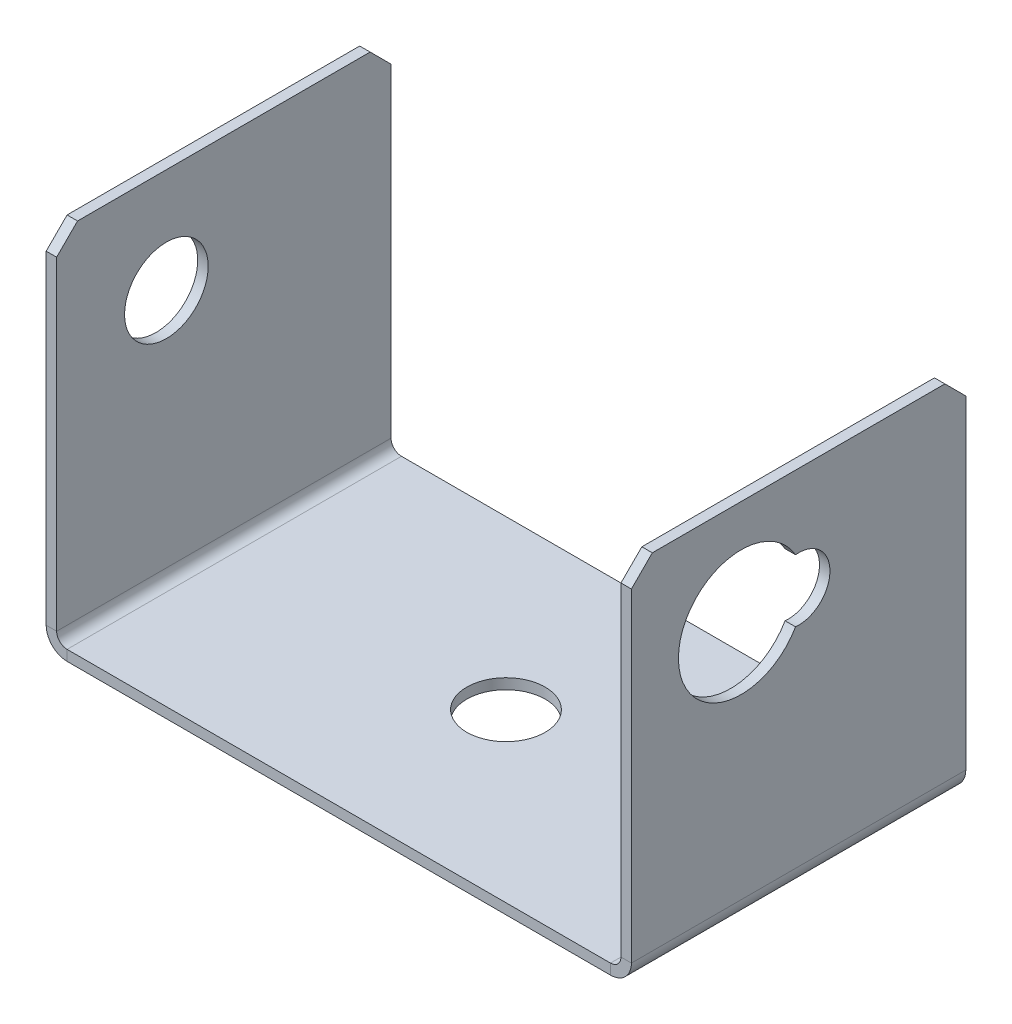
ISO-10303-21;
HEADER;
FILE_DESCRIPTION(('STEP AP214'),'2;1');
FILE_NAME('part.step','',(''),(''),'','','');
FILE_SCHEMA(('AUTOMOTIVE_DESIGN { 1 0 10303 214 1 1 1 1 }'));
ENDSEC;
DATA;
#1=APPLICATION_CONTEXT('core data for automotive mechanical design processes');
#2=APPLICATION_PROTOCOL_DEFINITION('international standard','automotive_design',2000,#1);
#3=PRODUCT_CONTEXT('',#1,'mechanical');
#4=PRODUCT('Part','Part','',(#3));
#5=PRODUCT_RELATED_PRODUCT_CATEGORY('part','',(#4));
#6=PRODUCT_DEFINITION_FORMATION('','',#4);
#7=PRODUCT_DEFINITION_CONTEXT('part definition',#1,'design');
#8=PRODUCT_DEFINITION('design','',#6,#7);
#9=PRODUCT_DEFINITION_SHAPE('','',#8);
#10=(LENGTH_UNIT() NAMED_UNIT(*) SI_UNIT(.MILLI.,.METRE.));
#11=(NAMED_UNIT(*) PLANE_ANGLE_UNIT() SI_UNIT($,.RADIAN.));
#12=(NAMED_UNIT(*) SI_UNIT($,.STERADIAN.) SOLID_ANGLE_UNIT());
#13=UNCERTAINTY_MEASURE_WITH_UNIT(LENGTH_MEASURE(1.E-05),#10,'distance_accuracy_value','');
#14=(GEOMETRIC_REPRESENTATION_CONTEXT(3) GLOBAL_UNCERTAINTY_ASSIGNED_CONTEXT((#13)) GLOBAL_UNIT_ASSIGNED_CONTEXT((#10,
#11,#12)) REPRESENTATION_CONTEXT('',''));
#15=CARTESIAN_POINT('',(0.,0.,0.));
#16=DIRECTION('',(0.,0.,1.));
#17=DIRECTION('',(1.,0.,0.));
#18=AXIS2_PLACEMENT_3D('',#15,#16,#17);
#19=CARTESIAN_POINT('',(0.,2.,32.));
#20=DIRECTION('',(0.,0.,1.));
#21=DIRECTION('',(1.,0.,0.));
#22=AXIS2_PLACEMENT_3D('',#19,#20,#21);
#23=PLANE('',#22);
#24=DIRECTION('',(1.,0.,0.));
#25=VECTOR('',#24,1.);
#26=CARTESIAN_POINT('',(0.,2.,32.));
#27=LINE('',#26,#25);
#28=CARTESIAN_POINT('',(0.,2.,32.));
#29=VERTEX_POINT('',#28);
#30=CARTESIAN_POINT('',(1.,2.,32.));
#31=VERTEX_POINT('',#30);
#32=EDGE_CURVE('E298',#29,#31,#27,.T.);
#33=ORIENTED_EDGE('',*,*,#32,.F.);
#34=CARTESIAN_POINT('',(2.,2.,32.));
#35=DIRECTION('',(0.,0.,-1.));
#36=DIRECTION('',(-1.,0.,0.));
#37=AXIS2_PLACEMENT_3D('',#34,#35,#36);
#38=CIRCLE('',#37,2.);
#39=CARTESIAN_POINT('',(2.,0.,32.));
#40=VERTEX_POINT('',#39);
#41=EDGE_CURVE('E214',#29,#40,#38,.F.);
#42=ORIENTED_EDGE('',*,*,#41,.T.);
#43=DIRECTION('',(0.,-1.,0.));
#44=VECTOR('',#43,1.);
#45=CARTESIAN_POINT('',(2.,1.,32.));
#46=LINE('',#45,#44);
#47=CARTESIAN_POINT('',(2.,1.,32.));
#48=VERTEX_POINT('',#47);
#49=EDGE_CURVE('E296',#48,#40,#46,.T.);
#50=ORIENTED_EDGE('',*,*,#49,.F.);
#51=CARTESIAN_POINT('',(2.,2.,32.));
#52=DIRECTION('',(0.,0.,1.));
#53=DIRECTION('',(1.,0.,0.));
#54=AXIS2_PLACEMENT_3D('',#51,#52,#53);
#55=CIRCLE('',#54,1.);
#56=EDGE_CURVE('E207',#31,#48,#55,.T.);
#57=ORIENTED_EDGE('',*,*,#56,.F.);
#58=EDGE_LOOP('',(#33,#42,#50,#57));
#59=FACE_BOUND('',#58,.T.);
#60=ADVANCED_FACE('F39',(#59),#23,.T.);
#61=CARTESIAN_POINT('',(2.,1.,32.));
#62=DIRECTION('',(0.,0.,1.));
#63=DIRECTION('',(1.,0.,0.));
#64=AXIS2_PLACEMENT_3D('',#61,#62,#63);
#65=PLANE('',#64);
#66=DIRECTION('',(0.,1.,0.));
#67=VECTOR('',#66,1.);
#68=CARTESIAN_POINT('',(1.,35.,32.));
#69=LINE('',#68,#67);
#70=CARTESIAN_POINT('',(1.,33.,32.));
#71=VERTEX_POINT('',#70);
#72=EDGE_CURVE('E210',#71,#31,#69,.F.);
#73=ORIENTED_EDGE('',*,*,#72,.F.);
#74=DIRECTION('',(-1.,0.,0.));
#75=VECTOR('',#74,1.);
#76=CARTESIAN_POINT('',(2.,33.,32.));
#77=LINE('',#76,#75);
#78=CARTESIAN_POINT('',(0.,33.,32.));
#79=VERTEX_POINT('',#78);
#80=EDGE_CURVE('E11',#71,#79,#77,.T.);
#81=ORIENTED_EDGE('',*,*,#80,.T.);
#82=DIRECTION('',(0.,-1.,0.));
#83=VECTOR('',#82,1.);
#84=CARTESIAN_POINT('',(0.,35.,32.));
#85=LINE('',#84,#83);
#86=EDGE_CURVE('E212',#79,#29,#85,.T.);
#87=ORIENTED_EDGE('',*,*,#86,.T.);
#88=ORIENTED_EDGE('',*,*,#32,.T.);
#89=EDGE_LOOP('',(#73,#81,#87,#88));
#90=FACE_BOUND('',#89,.T.);
#91=ADVANCED_FACE('F357',(#90),#65,.T.);
#92=CARTESIAN_POINT('',(2.,0.,0.));
#93=DIRECTION('',(0.,0.,-1.));
#94=DIRECTION('',(-1.,0.,0.));
#95=AXIS2_PLACEMENT_3D('',#92,#93,#94);
#96=PLANE('',#95);
#97=DIRECTION('',(0.,1.,0.));
#98=VECTOR('',#97,1.);
#99=CARTESIAN_POINT('',(2.,0.,0.));
#100=LINE('',#99,#98);
#101=CARTESIAN_POINT('',(2.,0.,0.));
#102=VERTEX_POINT('',#101);
#103=CARTESIAN_POINT('',(2.,1.,0.));
#104=VERTEX_POINT('',#103);
#105=EDGE_CURVE('E294',#102,#104,#100,.T.);
#106=ORIENTED_EDGE('',*,*,#105,.F.);
#107=CARTESIAN_POINT('',(2.,2.,0.));
#108=DIRECTION('',(0.,0.,-1.));
#109=DIRECTION('',(-1.,0.,0.));
#110=AXIS2_PLACEMENT_3D('',#107,#108,#109);
#111=CIRCLE('',#110,2.);
#112=CARTESIAN_POINT('',(0.,2.,0.));
#113=VERTEX_POINT('',#112);
#114=EDGE_CURVE('E242',#113,#102,#111,.F.);
#115=ORIENTED_EDGE('',*,*,#114,.F.);
#116=DIRECTION('',(-1.,0.,0.));
#117=VECTOR('',#116,1.);
#118=CARTESIAN_POINT('',(1.,2.,0.));
#119=LINE('',#118,#117);
#120=CARTESIAN_POINT('',(1.,2.,0.));
#121=VERTEX_POINT('',#120);
#122=EDGE_CURVE('E291',#121,#113,#119,.T.);
#123=ORIENTED_EDGE('',*,*,#122,.F.);
#124=CARTESIAN_POINT('',(2.,2.,0.));
#125=DIRECTION('',(0.,0.,1.));
#126=DIRECTION('',(1.,0.,0.));
#127=AXIS2_PLACEMENT_3D('',#124,#125,#126);
#128=CIRCLE('',#127,1.);
#129=EDGE_CURVE('E235',#121,#104,#128,.T.);
#130=ORIENTED_EDGE('',*,*,#129,.T.);
#131=EDGE_LOOP('',(#106,#115,#123,#130));
#132=FACE_BOUND('',#131,.T.);
#133=ADVANCED_FACE('F428',(#132),#96,.T.);
#134=CARTESIAN_POINT('',(1.,2.,0.));
#135=DIRECTION('',(0.,0.,-1.));
#136=DIRECTION('',(-1.,0.,0.));
#137=AXIS2_PLACEMENT_3D('',#134,#135,#136);
#138=PLANE('',#137);
#139=DIRECTION('',(1.,0.,0.));
#140=VECTOR('',#139,1.);
#141=CARTESIAN_POINT('',(0.,0.,0.));
#142=LINE('',#141,#140);
#143=CARTESIAN_POINT('',(54.,0.,0.));
#144=VERTEX_POINT('',#143);
#145=EDGE_CURVE('E245',#102,#144,#142,.T.);
#146=ORIENTED_EDGE('',*,*,#145,.F.);
#147=ORIENTED_EDGE('',*,*,#105,.T.);
#148=DIRECTION('',(1.,0.,0.));
#149=VECTOR('',#148,1.);
#150=CARTESIAN_POINT('',(0.,1.,0.));
#151=LINE('',#150,#149);
#152=CARTESIAN_POINT('',(54.,1.,0.));
#153=VERTEX_POINT('',#152);
#154=EDGE_CURVE('E232',#104,#153,#151,.T.);
#155=ORIENTED_EDGE('',*,*,#154,.T.);
#156=DIRECTION('',(0.,-1.,0.));
#157=VECTOR('',#156,1.);
#158=CARTESIAN_POINT('',(54.,1.,0.));
#159=LINE('',#158,#157);
#160=EDGE_CURVE('E283',#153,#144,#159,.T.);
#161=ORIENTED_EDGE('',*,*,#160,.T.);
#162=EDGE_LOOP('',(#146,#147,#155,#161));
#163=FACE_BOUND('',#162,.T.);
#164=ADVANCED_FACE('F678',(#163),#138,.T.);
#165=CARTESIAN_POINT('',(54.,0.,32.));
#166=DIRECTION('',(0.,0.,1.));
#167=DIRECTION('',(1.,0.,0.));
#168=AXIS2_PLACEMENT_3D('',#165,#166,#167);
#169=PLANE('',#168);
#170=DIRECTION('',(0.,1.,0.));
#171=VECTOR('',#170,1.);
#172=CARTESIAN_POINT('',(54.,0.,32.));
#173=LINE('',#172,#171);
#174=CARTESIAN_POINT('',(54.,0.,32.));
#175=VERTEX_POINT('',#174);
#176=CARTESIAN_POINT('',(54.,1.,32.));
#177=VERTEX_POINT('',#176);
#178=EDGE_CURVE('E289',#175,#177,#173,.T.);
#179=ORIENTED_EDGE('',*,*,#178,.F.);
#180=CARTESIAN_POINT('',(54.,2.,32.));
#181=DIRECTION('',(0.,0.,-1.));
#182=DIRECTION('',(-1.,0.,0.));
#183=AXIS2_PLACEMENT_3D('',#180,#181,#182);
#184=CIRCLE('',#183,2.);
#185=CARTESIAN_POINT('',(56.,2.,32.));
#186=VERTEX_POINT('',#185);
#187=EDGE_CURVE('E220',#175,#186,#184,.F.);
#188=ORIENTED_EDGE('',*,*,#187,.T.);
#189=DIRECTION('',(1.,0.,0.));
#190=VECTOR('',#189,1.);
#191=CARTESIAN_POINT('',(55.,2.,32.));
#192=LINE('',#191,#190);
#193=CARTESIAN_POINT('',(55.,2.,32.));
#194=VERTEX_POINT('',#193);
#195=EDGE_CURVE('E287',#194,#186,#192,.T.);
#196=ORIENTED_EDGE('',*,*,#195,.F.);
#197=CARTESIAN_POINT('',(54.,2.,32.));
#198=DIRECTION('',(0.,0.,1.));
#199=DIRECTION('',(1.,0.,0.));
#200=AXIS2_PLACEMENT_3D('',#197,#198,#199);
#201=CIRCLE('',#200,1.);
#202=EDGE_CURVE('E201',#177,#194,#201,.T.);
#203=ORIENTED_EDGE('',*,*,#202,.F.);
#204=EDGE_LOOP('',(#179,#188,#196,#203));
#205=FACE_BOUND('',#204,.T.);
#206=ADVANCED_FACE('F382',(#205),#169,.T.);
#207=CARTESIAN_POINT('',(55.,2.,32.));
#208=DIRECTION('',(0.,0.,1.));
#209=DIRECTION('',(1.,0.,0.));
#210=AXIS2_PLACEMENT_3D('',#207,#208,#209);
#211=PLANE('',#210);
#212=DIRECTION('',(1.,0.,0.));
#213=VECTOR('',#212,1.);
#214=CARTESIAN_POINT('',(0.,0.,32.));
#215=LINE('',#214,#213);
#216=EDGE_CURVE('E217',#40,#175,#215,.T.);
#217=ORIENTED_EDGE('',*,*,#216,.T.);
#218=ORIENTED_EDGE('',*,*,#178,.T.);
#219=DIRECTION('',(1.,0.,0.));
#220=VECTOR('',#219,1.);
#221=CARTESIAN_POINT('',(0.,1.,32.));
#222=LINE('',#221,#220);
#223=EDGE_CURVE('E204',#48,#177,#222,.T.);
#224=ORIENTED_EDGE('',*,*,#223,.F.);
#225=ORIENTED_EDGE('',*,*,#49,.T.);
#226=EDGE_LOOP('',(#217,#218,#224,#225));
#227=FACE_BOUND('',#226,.T.);
#228=ADVANCED_FACE('F373',(#227),#211,.T.);
#229=CARTESIAN_POINT('',(56.,2.,0.));
#230=DIRECTION('',(0.,0.,-1.));
#231=DIRECTION('',(-1.,0.,0.));
#232=AXIS2_PLACEMENT_3D('',#229,#230,#231);
#233=PLANE('',#232);
#234=DIRECTION('',(-1.,0.,0.));
#235=VECTOR('',#234,1.);
#236=CARTESIAN_POINT('',(56.,2.,0.));
#237=LINE('',#236,#235);
#238=CARTESIAN_POINT('',(56.,2.,0.));
#239=VERTEX_POINT('',#238);
#240=CARTESIAN_POINT('',(55.,2.,0.));
#241=VERTEX_POINT('',#240);
#242=EDGE_CURVE('E285',#239,#241,#237,.T.);
#243=ORIENTED_EDGE('',*,*,#242,.F.);
#244=CARTESIAN_POINT('',(54.,2.,0.));
#245=DIRECTION('',(0.,0.,-1.));
#246=DIRECTION('',(-1.,0.,0.));
#247=AXIS2_PLACEMENT_3D('',#244,#245,#246);
#248=CIRCLE('',#247,2.);
#249=EDGE_CURVE('E198',#144,#239,#248,.F.);
#250=ORIENTED_EDGE('',*,*,#249,.F.);
#251=ORIENTED_EDGE('',*,*,#160,.F.);
#252=CARTESIAN_POINT('',(54.,2.,0.));
#253=DIRECTION('',(0.,0.,1.));
#254=DIRECTION('',(1.,0.,0.));
#255=AXIS2_PLACEMENT_3D('',#252,#253,#254);
#256=CIRCLE('',#255,1.);
#257=EDGE_CURVE('E229',#153,#241,#256,.T.);
#258=ORIENTED_EDGE('',*,*,#257,.T.);
#259=EDGE_LOOP('',(#243,#250,#251,#258));
#260=FACE_BOUND('',#259,.T.);
#261=ADVANCED_FACE('F412',(#260),#233,.T.);
#262=CARTESIAN_POINT('',(54.,1.,0.));
#263=DIRECTION('',(0.,0.,-1.));
#264=DIRECTION('',(-1.,0.,0.));
#265=AXIS2_PLACEMENT_3D('',#262,#263,#264);
#266=PLANE('',#265);
#267=DIRECTION('',(0.,1.,0.));
#268=VECTOR('',#267,1.);
#269=CARTESIAN_POINT('',(55.,0.,0.));
#270=LINE('',#269,#268);
#271=CARTESIAN_POINT('',(55.,33.,0.));
#272=VERTEX_POINT('',#271);
#273=EDGE_CURVE('E226',#241,#272,#270,.T.);
#274=ORIENTED_EDGE('',*,*,#273,.T.);
#275=DIRECTION('',(1.,0.,0.));
#276=VECTOR('',#275,1.);
#277=CARTESIAN_POINT('',(54.,33.,0.));
#278=LINE('',#277,#276);
#279=CARTESIAN_POINT('',(56.,33.,0.));
#280=VERTEX_POINT('',#279);
#281=EDGE_CURVE('E323',#272,#280,#278,.T.);
#282=ORIENTED_EDGE('',*,*,#281,.T.);
#283=DIRECTION('',(0.,1.,0.));
#284=VECTOR('',#283,1.);
#285=CARTESIAN_POINT('',(56.,0.,0.));
#286=LINE('',#285,#284);
#287=EDGE_CURVE('E176',#239,#280,#286,.T.);
#288=ORIENTED_EDGE('',*,*,#287,.F.);
#289=ORIENTED_EDGE('',*,*,#242,.T.);
#290=EDGE_LOOP('',(#274,#282,#288,#289));
#291=FACE_BOUND('',#290,.T.);
#292=ADVANCED_FACE('F408',(#291),#266,.T.);
#293=CARTESIAN_POINT('',(56.,0.,32.));
#294=DIRECTION('',(-1.,0.,0.));
#295=DIRECTION('',(0.,0.,1.));
#296=AXIS2_PLACEMENT_3D('',#293,#294,#295);
#297=PLANE('',#296);
#298=CARTESIAN_POINT('',(56.,25.,21.5));
#299=DIRECTION('',(1.,0.,0.));
#300=DIRECTION('',(0.,0.,-1.));
#301=AXIS2_PLACEMENT_3D('',#298,#299,#300);
#302=CIRCLE('',#301,6.);
#303=CARTESIAN_POINT('',(56.,27.985415651391,16.2954545454545));
#304=VERTEX_POINT('',#303);
#305=CARTESIAN_POINT('',(56.,22.014584348609,16.2954545454545));
#306=VERTEX_POINT('',#305);
#307=EDGE_CURVE('E180',#304,#306,#302,.T.);
#308=ORIENTED_EDGE('',*,*,#307,.F.);
#309=CARTESIAN_POINT('',(56.,25.,16.));
#310=DIRECTION('',(1.,0.,0.));
#311=DIRECTION('',(0.,0.,-1.));
#312=AXIS2_PLACEMENT_3D('',#309,#310,#311);
#313=CIRCLE('',#312,2.99999999999999);
#314=EDGE_CURVE('E170',#306,#304,#313,.T.);
#315=ORIENTED_EDGE('',*,*,#314,.F.);
#316=EDGE_LOOP('',(#308,#315));
#317=FACE_BOUND('',#316,.T.);
#318=DIRECTION('',(0.,0.,-1.));
#319=VECTOR('',#318,1.);
#320=CARTESIAN_POINT('',(56.,35.,32.));
#321=LINE('',#320,#319);
#322=CARTESIAN_POINT('',(56.,35.,30.));
#323=VERTEX_POINT('',#322);
#324=CARTESIAN_POINT('',(56.,35.,2.));
#325=VERTEX_POINT('',#324);
#326=EDGE_CURVE('E280',#323,#325,#321,.T.);
#327=ORIENTED_EDGE('',*,*,#326,.F.);
#328=DIRECTION('',(0.,0.707106781186548,-0.707106781186548));
#329=VECTOR('',#328,1.);
#330=CARTESIAN_POINT('',(56.,35.,30.));
#331=LINE('',#330,#329);
#332=CARTESIAN_POINT('',(56.,33.,32.));
#333=VERTEX_POINT('',#332);
#334=EDGE_CURVE('E315',#323,#333,#331,.F.);
#335=ORIENTED_EDGE('',*,*,#334,.T.);
#336=DIRECTION('',(0.,1.,0.));
#337=VECTOR('',#336,1.);
#338=CARTESIAN_POINT('',(56.,0.,32.));
#339=LINE('',#338,#337);
#340=EDGE_CURVE('E194',#186,#333,#339,.T.);
#341=ORIENTED_EDGE('',*,*,#340,.F.);
#342=DIRECTION('',(0.,0.,-1.));
#343=VECTOR('',#342,1.);
#344=CARTESIAN_POINT('',(56.,2.,32.));
#345=LINE('',#344,#343);
#346=EDGE_CURVE('E223',#186,#239,#345,.T.);
#347=ORIENTED_EDGE('',*,*,#346,.T.);
#348=ORIENTED_EDGE('',*,*,#287,.T.);
#349=DIRECTION('',(0.,-0.707106781186548,-0.707106781186548));
#350=VECTOR('',#349,1.);
#351=CARTESIAN_POINT('',(56.,33.,0.));
#352=LINE('',#351,#350);
#353=EDGE_CURVE('E313',#280,#325,#352,.F.);
#354=ORIENTED_EDGE('',*,*,#353,.T.);
#355=EDGE_LOOP('',(#327,#335,#341,#347,#348,#354));
#356=FACE_BOUND('',#355,.T.);
#357=ADVANCED_FACE('F184',(#317,#356),#297,.F.);
#358=CARTESIAN_POINT('',(55.,35.,32.));
#359=DIRECTION('',(0.,1.,0.));
#360=DIRECTION('',(0.,0.,1.));
#361=AXIS2_PLACEMENT_3D('',#358,#359,#360);
#362=PLANE('',#361);
#363=DIRECTION('',(0.,0.,-1.));
#364=VECTOR('',#363,1.);
#365=CARTESIAN_POINT('',(55.,35.,32.));
#366=LINE('',#365,#364);
#367=CARTESIAN_POINT('',(55.,35.,30.));
#368=VERTEX_POINT('',#367);
#369=CARTESIAN_POINT('',(55.,35.,2.));
#370=VERTEX_POINT('',#369);
#371=EDGE_CURVE('E277',#368,#370,#366,.T.);
#372=ORIENTED_EDGE('',*,*,#371,.F.);
#373=DIRECTION('',(1.,0.,0.));
#374=VECTOR('',#373,1.);
#375=CARTESIAN_POINT('',(55.,35.,30.));
#376=LINE('',#375,#374);
#377=EDGE_CURVE('E310',#368,#323,#376,.T.);
#378=ORIENTED_EDGE('',*,*,#377,.T.);
#379=ORIENTED_EDGE('',*,*,#326,.T.);
#380=DIRECTION('',(-1.,0.,0.));
#381=VECTOR('',#380,1.);
#382=CARTESIAN_POINT('',(55.,35.,2.));
#383=LINE('',#382,#381);
#384=EDGE_CURVE('E304',#325,#370,#383,.T.);
#385=ORIENTED_EDGE('',*,*,#384,.T.);
#386=EDGE_LOOP('',(#372,#378,#379,#385));
#387=FACE_BOUND('',#386,.T.);
#388=ADVANCED_FACE('F401',(#387),#362,.T.);
#389=CARTESIAN_POINT('',(55.,0.,32.));
#390=DIRECTION('',(-1.,0.,0.));
#391=DIRECTION('',(0.,0.,1.));
#392=AXIS2_PLACEMENT_3D('',#389,#390,#391);
#393=PLANE('',#392);
#394=CARTESIAN_POINT('',(55.,25.,16.));
#395=DIRECTION('',(-1.,0.,0.));
#396=DIRECTION('',(0.,0.,1.));
#397=AXIS2_PLACEMENT_3D('',#394,#395,#396);
#398=CIRCLE('',#397,2.99999999999999);
#399=CARTESIAN_POINT('',(55.,27.985415651391,16.2954545454545));
#400=VERTEX_POINT('',#399);
#401=CARTESIAN_POINT('',(55.,22.014584348609,16.2954545454545));
#402=VERTEX_POINT('',#401);
#403=EDGE_CURVE('E173',#400,#402,#398,.T.);
#404=ORIENTED_EDGE('',*,*,#403,.F.);
#405=CARTESIAN_POINT('',(55.,25.,21.5));
#406=DIRECTION('',(-1.,0.,0.));
#407=DIRECTION('',(0.,0.,1.));
#408=AXIS2_PLACEMENT_3D('',#405,#406,#407);
#409=CIRCLE('',#408,6.);
#410=EDGE_CURVE('E301',#402,#400,#409,.T.);
#411=ORIENTED_EDGE('',*,*,#410,.F.);
#412=EDGE_LOOP('',(#404,#411));
#413=FACE_BOUND('',#412,.T.);
#414=DIRECTION('',(0.,1.,0.));
#415=VECTOR('',#414,1.);
#416=CARTESIAN_POINT('',(55.,0.,32.));
#417=LINE('',#416,#415);
#418=CARTESIAN_POINT('',(55.,33.,32.));
#419=VERTEX_POINT('',#418);
#420=EDGE_CURVE('E197',#194,#419,#417,.T.);
#421=ORIENTED_EDGE('',*,*,#420,.T.);
#422=DIRECTION('',(0.,-0.707106781186548,0.707106781186548));
#423=VECTOR('',#422,1.);
#424=CARTESIAN_POINT('',(55.,16.5,48.5));
#425=LINE('',#424,#423);
#426=EDGE_CURVE('E321',#419,#368,#425,.F.);
#427=ORIENTED_EDGE('',*,*,#426,.T.);
#428=ORIENTED_EDGE('',*,*,#371,.T.);
#429=DIRECTION('',(0.,0.707106781186548,0.707106781186548));
#430=VECTOR('',#429,1.);
#431=CARTESIAN_POINT('',(55.,32.5,-0.500000000000007));
#432=LINE('',#431,#430);
#433=EDGE_CURVE('E319',#370,#272,#432,.F.);
#434=ORIENTED_EDGE('',*,*,#433,.T.);
#435=ORIENTED_EDGE('',*,*,#273,.F.);
#436=DIRECTION('',(0.,0.,-1.));
#437=VECTOR('',#436,1.);
#438=CARTESIAN_POINT('',(55.,2.,32.));
#439=LINE('',#438,#437);
#440=EDGE_CURVE('E274',#194,#241,#439,.T.);
#441=ORIENTED_EDGE('',*,*,#440,.F.);
#442=EDGE_LOOP('',(#421,#427,#428,#434,#435,#441));
#443=FACE_BOUND('',#442,.T.);
#444=ADVANCED_FACE('F390',(#413,#443),#393,.T.);
#445=CARTESIAN_POINT('',(54.,2.,32.));
#446=DIRECTION('',(0.,0.,-1.));
#447=DIRECTION('',(-1.,0.,0.));
#448=AXIS2_PLACEMENT_3D('',#445,#446,#447);
#449=CYLINDRICAL_SURFACE('',#448,1.);
#450=ORIENTED_EDGE('',*,*,#257,.F.);
#451=DIRECTION('',(0.,0.,-1.));
#452=VECTOR('',#451,1.);
#453=CARTESIAN_POINT('',(54.,1.,32.));
#454=LINE('',#453,#452);
#455=EDGE_CURVE('E271',#177,#153,#454,.T.);
#456=ORIENTED_EDGE('',*,*,#455,.F.);
#457=ORIENTED_EDGE('',*,*,#202,.T.);
#458=ORIENTED_EDGE('',*,*,#440,.T.);
#459=EDGE_LOOP('',(#450,#456,#457,#458));
#460=FACE_BOUND('',#459,.T.);
#461=ADVANCED_FACE('F381',(#460),#449,.F.);
#462=CARTESIAN_POINT('',(0.,1.,32.));
#463=DIRECTION('',(0.,1.,0.));
#464=DIRECTION('',(0.,0.,1.));
#465=AXIS2_PLACEMENT_3D('',#462,#463,#464);
#466=PLANE('',#465);
#467=CARTESIAN_POINT('',(28.,1.,16.));
#468=DIRECTION('',(0.,1.,0.));
#469=DIRECTION('',(0.,0.,1.));
#470=AXIS2_PLACEMENT_3D('',#467,#468,#469);
#471=CIRCLE('',#470,3.75000000000001);
#472=CARTESIAN_POINT('',(28.,1.,19.75));
#473=VERTEX_POINT('',#472);
#474=EDGE_CURVE('E308',#473,#473,#471,.T.);
#475=ORIENTED_EDGE('',*,*,#474,.F.);
#476=EDGE_LOOP('',(#475));
#477=FACE_BOUND('',#476,.T.);
#478=ORIENTED_EDGE('',*,*,#154,.F.);
#479=DIRECTION('',(0.,0.,-1.));
#480=VECTOR('',#479,1.);
#481=CARTESIAN_POINT('',(2.,1.,32.));
#482=LINE('',#481,#480);
#483=EDGE_CURVE('E268',#48,#104,#482,.T.);
#484=ORIENTED_EDGE('',*,*,#483,.F.);
#485=ORIENTED_EDGE('',*,*,#223,.T.);
#486=ORIENTED_EDGE('',*,*,#455,.T.);
#487=EDGE_LOOP('',(#478,#484,#485,#486));
#488=FACE_BOUND('',#487,.T.);
#489=ADVANCED_FACE('F372',(#477,#488),#466,.T.);
#490=CARTESIAN_POINT('',(2.,2.,32.));
#491=DIRECTION('',(0.,0.,-1.));
#492=DIRECTION('',(-1.,0.,0.));
#493=AXIS2_PLACEMENT_3D('',#490,#491,#492);
#494=CYLINDRICAL_SURFACE('',#493,1.);
#495=ORIENTED_EDGE('',*,*,#129,.F.);
#496=DIRECTION('',(0.,0.,-1.));
#497=VECTOR('',#496,1.);
#498=CARTESIAN_POINT('',(1.,2.,32.));
#499=LINE('',#498,#497);
#500=EDGE_CURVE('E265',#31,#121,#499,.T.);
#501=ORIENTED_EDGE('',*,*,#500,.F.);
#502=ORIENTED_EDGE('',*,*,#56,.T.);
#503=ORIENTED_EDGE('',*,*,#483,.T.);
#504=EDGE_LOOP('',(#495,#501,#502,#503));
#505=FACE_BOUND('',#504,.T.);
#506=ADVANCED_FACE('F364',(#505),#494,.F.);
#507=CARTESIAN_POINT('',(1.,35.,32.));
#508=DIRECTION('',(1.,0.,0.));
#509=DIRECTION('',(0.,0.,-1.));
#510=AXIS2_PLACEMENT_3D('',#507,#508,#509);
#511=PLANE('',#510);
#512=CARTESIAN_POINT('',(0.999999999999999,25.,21.5));
#513=DIRECTION('',(1.,0.,0.));
#514=DIRECTION('',(0.,0.,-1.));
#515=AXIS2_PLACEMENT_3D('',#512,#513,#514);
#516=CIRCLE('',#515,4.);
#517=CARTESIAN_POINT('',(0.999999999999999,25.,17.5));
#518=VERTEX_POINT('',#517);
#519=EDGE_CURVE('E186',#518,#518,#516,.T.);
#520=ORIENTED_EDGE('',*,*,#519,.F.);
#521=EDGE_LOOP('',(#520));
#522=FACE_BOUND('',#521,.T.);
#523=DIRECTION('',(0.,1.,0.));
#524=VECTOR('',#523,1.);
#525=CARTESIAN_POINT('',(1.,35.,0.));
#526=LINE('',#525,#524);
#527=CARTESIAN_POINT('',(1.,33.,0.));
#528=VERTEX_POINT('',#527);
#529=EDGE_CURVE('E238',#528,#121,#526,.F.);
#530=ORIENTED_EDGE('',*,*,#529,.F.);
#531=DIRECTION('',(0.,0.707106781186548,0.707106781186548));
#532=VECTOR('',#531,1.);
#533=CARTESIAN_POINT('',(1.,50.,17.));
#534=LINE('',#533,#532);
#535=CARTESIAN_POINT('',(1.,35.,2.));
#536=VERTEX_POINT('',#535);
#537=EDGE_CURVE('E331',#528,#536,#534,.T.);
#538=ORIENTED_EDGE('',*,*,#537,.T.);
#539=DIRECTION('',(0.,0.,-1.));
#540=VECTOR('',#539,1.);
#541=CARTESIAN_POINT('',(1.,35.,32.));
#542=LINE('',#541,#540);
#543=CARTESIAN_POINT('',(1.,35.,30.));
#544=VERTEX_POINT('',#543);
#545=EDGE_CURVE('E263',#544,#536,#542,.T.);
#546=ORIENTED_EDGE('',*,*,#545,.F.);
#547=DIRECTION('',(0.,0.707106781186548,-0.707106781186548));
#548=VECTOR('',#547,1.);
#549=CARTESIAN_POINT('',(1.,34.,31.));
#550=LINE('',#549,#548);
#551=EDGE_CURVE('E329',#544,#71,#550,.F.);
#552=ORIENTED_EDGE('',*,*,#551,.T.);
#553=ORIENTED_EDGE('',*,*,#72,.T.);
#554=ORIENTED_EDGE('',*,*,#500,.T.);
#555=EDGE_LOOP('',(#530,#538,#546,#552,#553,#554));
#556=FACE_BOUND('',#555,.T.);
#557=ADVANCED_FACE('F352',(#522,#556),#511,.T.);
#558=CARTESIAN_POINT('',(0.,35.,32.));
#559=DIRECTION('',(0.,1.,0.));
#560=DIRECTION('',(0.,0.,1.));
#561=AXIS2_PLACEMENT_3D('',#558,#559,#560);
#562=PLANE('',#561);
#563=ORIENTED_EDGE('',*,*,#545,.T.);
#564=DIRECTION('',(-1.,0.,0.));
#565=VECTOR('',#564,1.);
#566=CARTESIAN_POINT('',(0.,35.,2.));
#567=LINE('',#566,#565);
#568=CARTESIAN_POINT('',(0.,35.,2.));
#569=VERTEX_POINT('',#568);
#570=EDGE_CURVE('E61',#536,#569,#567,.T.);
#571=ORIENTED_EDGE('',*,*,#570,.T.);
#572=DIRECTION('',(0.,0.,-1.));
#573=VECTOR('',#572,1.);
#574=CARTESIAN_POINT('',(0.,35.,32.));
#575=LINE('',#574,#573);
#576=CARTESIAN_POINT('',(0.,35.,30.));
#577=VERTEX_POINT('',#576);
#578=EDGE_CURVE('E261',#577,#569,#575,.T.);
#579=ORIENTED_EDGE('',*,*,#578,.F.);
#580=DIRECTION('',(1.,0.,0.));
#581=VECTOR('',#580,1.);
#582=CARTESIAN_POINT('',(0.,35.,30.));
#583=LINE('',#582,#581);
#584=EDGE_CURVE('E333',#577,#544,#583,.T.);
#585=ORIENTED_EDGE('',*,*,#584,.T.);
#586=EDGE_LOOP('',(#563,#571,#579,#585));
#587=FACE_BOUND('',#586,.T.);
#588=ADVANCED_FACE('F353',(#587),#562,.T.);
#589=CARTESIAN_POINT('',(0.,35.,32.));
#590=DIRECTION('',(1.,0.,0.));
#591=DIRECTION('',(0.,0.,-1.));
#592=AXIS2_PLACEMENT_3D('',#589,#590,#591);
#593=PLANE('',#592);
#594=CARTESIAN_POINT('',(0.,25.,21.5));
#595=DIRECTION('',(-1.,0.,0.));
#596=DIRECTION('',(0.,0.,1.));
#597=AXIS2_PLACEMENT_3D('',#594,#595,#596);
#598=CIRCLE('',#597,4.);
#599=CARTESIAN_POINT('',(0.,25.,25.5));
#600=VERTEX_POINT('',#599);
#601=EDGE_CURVE('E189',#600,#600,#598,.T.);
#602=ORIENTED_EDGE('',*,*,#601,.F.);
#603=EDGE_LOOP('',(#602));
#604=FACE_BOUND('',#603,.T.);
#605=ORIENTED_EDGE('',*,*,#578,.T.);
#606=DIRECTION('',(0.,-0.707106781186548,-0.707106781186548));
#607=VECTOR('',#606,1.);
#608=CARTESIAN_POINT('',(0.,33.,0.));
#609=LINE('',#608,#607);
#610=CARTESIAN_POINT('',(0.,33.,0.));
#611=VERTEX_POINT('',#610);
#612=EDGE_CURVE('E48',#569,#611,#609,.T.);
#613=ORIENTED_EDGE('',*,*,#612,.T.);
#614=DIRECTION('',(0.,-1.,0.));
#615=VECTOR('',#614,1.);
#616=CARTESIAN_POINT('',(0.,35.,0.));
#617=LINE('',#616,#615);
#618=EDGE_CURVE('E240',#611,#113,#617,.T.);
#619=ORIENTED_EDGE('',*,*,#618,.T.);
#620=DIRECTION('',(0.,0.,-1.));
#621=VECTOR('',#620,1.);
#622=CARTESIAN_POINT('',(0.,2.,32.));
#623=LINE('',#622,#621);
#624=EDGE_CURVE('E258',#29,#113,#623,.T.);
#625=ORIENTED_EDGE('',*,*,#624,.F.);
#626=ORIENTED_EDGE('',*,*,#86,.F.);
#627=DIRECTION('',(0.,-0.707106781186548,0.707106781186548));
#628=VECTOR('',#627,1.);
#629=CARTESIAN_POINT('',(0.,35.,30.));
#630=LINE('',#629,#628);
#631=EDGE_CURVE('E337',#79,#577,#630,.F.);
#632=ORIENTED_EDGE('',*,*,#631,.T.);
#633=EDGE_LOOP('',(#605,#613,#619,#625,#626,#632));
#634=FACE_BOUND('',#633,.T.);
#635=ADVANCED_FACE('F341',(#604,#634),#593,.F.);
#636=CARTESIAN_POINT('',(2.,2.,32.));
#637=DIRECTION('',(0.,0.,-1.));
#638=DIRECTION('',(-1.,0.,0.));
#639=AXIS2_PLACEMENT_3D('',#636,#637,#638);
#640=CYLINDRICAL_SURFACE('',#639,2.);
#641=ORIENTED_EDGE('',*,*,#114,.T.);
#642=DIRECTION('',(0.,0.,-1.));
#643=VECTOR('',#642,1.);
#644=CARTESIAN_POINT('',(2.,0.,32.));
#645=LINE('',#644,#643);
#646=EDGE_CURVE('E255',#40,#102,#645,.T.);
#647=ORIENTED_EDGE('',*,*,#646,.F.);
#648=ORIENTED_EDGE('',*,*,#41,.F.);
#649=ORIENTED_EDGE('',*,*,#624,.T.);
#650=EDGE_LOOP('',(#641,#647,#648,#649));
#651=FACE_BOUND('',#650,.T.);
#652=ADVANCED_FACE('F500',(#651),#640,.T.);
#653=CARTESIAN_POINT('',(0.,0.,32.));
#654=DIRECTION('',(0.,1.,0.));
#655=DIRECTION('',(0.,0.,1.));
#656=AXIS2_PLACEMENT_3D('',#653,#654,#655);
#657=PLANE('',#656);
#658=CARTESIAN_POINT('',(28.,0.,16.));
#659=DIRECTION('',(0.,1.,0.));
#660=DIRECTION('',(0.,0.,1.));
#661=AXIS2_PLACEMENT_3D('',#658,#659,#660);
#662=CIRCLE('',#661,3.75000000000001);
#663=CARTESIAN_POINT('',(28.,0.,19.75));
#664=VERTEX_POINT('',#663);
#665=EDGE_CURVE('E305',#664,#664,#662,.T.);
#666=ORIENTED_EDGE('',*,*,#665,.T.);
#667=EDGE_LOOP('',(#666));
#668=FACE_BOUND('',#667,.T.);
#669=ORIENTED_EDGE('',*,*,#145,.T.);
#670=DIRECTION('',(0.,0.,-1.));
#671=VECTOR('',#670,1.);
#672=CARTESIAN_POINT('',(54.,0.,32.));
#673=LINE('',#672,#671);
#674=EDGE_CURVE('E252',#175,#144,#673,.T.);
#675=ORIENTED_EDGE('',*,*,#674,.F.);
#676=ORIENTED_EDGE('',*,*,#216,.F.);
#677=ORIENTED_EDGE('',*,*,#646,.T.);
#678=EDGE_LOOP('',(#669,#675,#676,#677));
#679=FACE_BOUND('',#678,.T.);
#680=ADVANCED_FACE('F584',(#668,#679),#657,.F.);
#681=CARTESIAN_POINT('',(54.,2.,32.));
#682=DIRECTION('',(0.,0.,-1.));
#683=DIRECTION('',(-1.,0.,0.));
#684=AXIS2_PLACEMENT_3D('',#681,#682,#683);
#685=CYLINDRICAL_SURFACE('',#684,2.);
#686=ORIENTED_EDGE('',*,*,#249,.T.);
#687=ORIENTED_EDGE('',*,*,#346,.F.);
#688=ORIENTED_EDGE('',*,*,#187,.F.);
#689=ORIENTED_EDGE('',*,*,#674,.T.);
#690=EDGE_LOOP('',(#686,#687,#688,#689));
#691=FACE_BOUND('',#690,.T.);
#692=ADVANCED_FACE('F414',(#691),#685,.T.);
#693=CARTESIAN_POINT('',(54.,2.,32.));
#694=DIRECTION('',(0.,0.,1.));
#695=DIRECTION('',(1.,0.,0.));
#696=AXIS2_PLACEMENT_3D('',#693,#694,#695);
#697=PLANE('',#696);
#698=ORIENTED_EDGE('',*,*,#340,.T.);
#699=DIRECTION('',(-1.,0.,0.));
#700=VECTOR('',#699,1.);
#701=CARTESIAN_POINT('',(54.,33.,32.));
#702=LINE('',#701,#700);
#703=EDGE_CURVE('E317',#333,#419,#702,.T.);
#704=ORIENTED_EDGE('',*,*,#703,.T.);
#705=ORIENTED_EDGE('',*,*,#420,.F.);
#706=ORIENTED_EDGE('',*,*,#195,.T.);
#707=EDGE_LOOP('',(#698,#704,#705,#706));
#708=FACE_BOUND('',#707,.T.);
#709=ADVANCED_FACE('F392',(#708),#697,.T.);
#710=CARTESIAN_POINT('',(54.,2.,0.));
#711=DIRECTION('',(0.,0.,1.));
#712=DIRECTION('',(1.,0.,0.));
#713=AXIS2_PLACEMENT_3D('',#710,#711,#712);
#714=PLANE('',#713);
#715=ORIENTED_EDGE('',*,*,#618,.F.);
#716=DIRECTION('',(1.,0.,0.));
#717=VECTOR('',#716,1.);
#718=CARTESIAN_POINT('',(1.,33.,0.));
#719=LINE('',#718,#717);
#720=EDGE_CURVE('E326',#611,#528,#719,.T.);
#721=ORIENTED_EDGE('',*,*,#720,.T.);
#722=ORIENTED_EDGE('',*,*,#529,.T.);
#723=ORIENTED_EDGE('',*,*,#122,.T.);
#724=EDGE_LOOP('',(#715,#721,#722,#723));
#725=FACE_BOUND('',#724,.T.);
#726=ADVANCED_FACE('F346',(#725),#714,.F.);
#727=CARTESIAN_POINT('',(46.,25.,16.));
#728=DIRECTION('',(1.,0.,0.));
#729=DIRECTION('',(0.,0.,-1.));
#730=AXIS2_PLACEMENT_3D('',#727,#728,#729);
#731=CYLINDRICAL_SURFACE('',#730,2.99999999999999);
#732=ORIENTED_EDGE('',*,*,#403,.T.);
#733=DIRECTION('',(1.,0.,0.));
#734=VECTOR('',#733,1.);
#735=CARTESIAN_POINT('',(46.,22.014584348609,16.2954545454545));
#736=LINE('',#735,#734);
#737=EDGE_CURVE('E165',#402,#306,#736,.T.);
#738=ORIENTED_EDGE('',*,*,#737,.T.);
#739=ORIENTED_EDGE('',*,*,#314,.T.);
#740=DIRECTION('',(1.,0.,0.));
#741=VECTOR('',#740,1.);
#742=CARTESIAN_POINT('',(46.,27.985415651391,16.2954545454545));
#743=LINE('',#742,#741);
#744=EDGE_CURVE('E177',#400,#304,#743,.T.);
#745=ORIENTED_EDGE('',*,*,#744,.F.);
#746=EDGE_LOOP('',(#732,#738,#739,#745));
#747=FACE_BOUND('',#746,.T.);
#748=ADVANCED_FACE('F167',(#747),#731,.F.);
#749=CARTESIAN_POINT('',(46.,25.,21.5));
#750=DIRECTION('',(1.,0.,0.));
#751=DIRECTION('',(0.,0.,-1.));
#752=AXIS2_PLACEMENT_3D('',#749,#750,#751);
#753=CYLINDRICAL_SURFACE('',#752,6.);
#754=ORIENTED_EDGE('',*,*,#410,.T.);
#755=ORIENTED_EDGE('',*,*,#744,.T.);
#756=ORIENTED_EDGE('',*,*,#307,.T.);
#757=ORIENTED_EDGE('',*,*,#737,.F.);
#758=EDGE_LOOP('',(#754,#755,#756,#757));
#759=FACE_BOUND('',#758,.T.);
#760=ADVANCED_FACE('F181',(#759),#753,.F.);
#761=CARTESIAN_POINT('',(10.,25.,21.5));
#762=DIRECTION('',(-1.,0.,0.));
#763=DIRECTION('',(0.,0.,1.));
#764=AXIS2_PLACEMENT_3D('',#761,#762,#763);
#765=CYLINDRICAL_SURFACE('',#764,4.);
#766=ORIENTED_EDGE('',*,*,#519,.T.);
#767=EDGE_LOOP('',(#766));
#768=FACE_BOUND('',#767,.T.);
#769=ORIENTED_EDGE('',*,*,#601,.T.);
#770=EDGE_LOOP('',(#769));
#771=FACE_BOUND('',#770,.T.);
#772=ADVANCED_FACE('F575',(#768,#771),#765,.F.);
#773=CARTESIAN_POINT('',(28.,-9.,16.));
#774=DIRECTION('',(0.,1.,0.));
#775=DIRECTION('',(0.,0.,1.));
#776=AXIS2_PLACEMENT_3D('',#773,#774,#775);
#777=CYLINDRICAL_SURFACE('',#776,3.75000000000001);
#778=ORIENTED_EDGE('',*,*,#474,.T.);
#779=EDGE_LOOP('',(#778));
#780=FACE_BOUND('',#779,.T.);
#781=ORIENTED_EDGE('',*,*,#665,.F.);
#782=EDGE_LOOP('',(#781));
#783=FACE_BOUND('',#782,.T.);
#784=ADVANCED_FACE('F438',(#780,#783),#777,.F.);
#785=CARTESIAN_POINT('',(55.,35.,30.));
#786=DIRECTION('',(0.,-0.707106781186547,-0.707106781186547));
#787=DIRECTION('',(1.,0.,0.));
#788=AXIS2_PLACEMENT_3D('',#785,#786,#787);
#789=PLANE('',#788);
#790=ORIENTED_EDGE('',*,*,#426,.F.);
#791=ORIENTED_EDGE('',*,*,#703,.F.);
#792=ORIENTED_EDGE('',*,*,#334,.F.);
#793=ORIENTED_EDGE('',*,*,#377,.F.);
#794=EDGE_LOOP('',(#790,#791,#792,#793));
#795=FACE_BOUND('',#794,.T.);
#796=ADVANCED_FACE('F396',(#795),#789,.F.);
#797=CARTESIAN_POINT('',(54.,33.,0.));
#798=DIRECTION('',(0.,-0.707106781186547,0.707106781186547));
#799=DIRECTION('',(1.,0.,0.));
#800=AXIS2_PLACEMENT_3D('',#797,#798,#799);
#801=PLANE('',#800);
#802=ORIENTED_EDGE('',*,*,#433,.F.);
#803=ORIENTED_EDGE('',*,*,#384,.F.);
#804=ORIENTED_EDGE('',*,*,#353,.F.);
#805=ORIENTED_EDGE('',*,*,#281,.F.);
#806=EDGE_LOOP('',(#802,#803,#804,#805));
#807=FACE_BOUND('',#806,.T.);
#808=ADVANCED_FACE('F405',(#807),#801,.F.);
#809=CARTESIAN_POINT('',(54.,33.,0.));
#810=DIRECTION('',(0.,0.707106781186547,-0.707106781186547));
#811=DIRECTION('',(-1.,0.,0.));
#812=AXIS2_PLACEMENT_3D('',#809,#810,#811);
#813=PLANE('',#812);
#814=ORIENTED_EDGE('',*,*,#612,.F.);
#815=ORIENTED_EDGE('',*,*,#570,.F.);
#816=ORIENTED_EDGE('',*,*,#537,.F.);
#817=ORIENTED_EDGE('',*,*,#720,.F.);
#818=EDGE_LOOP('',(#814,#815,#816,#817));
#819=FACE_BOUND('',#818,.T.);
#820=ADVANCED_FACE('F349',(#819),#813,.T.);
#821=CARTESIAN_POINT('',(0.,35.,30.));
#822=DIRECTION('',(0.,-0.707106781186547,-0.707106781186547));
#823=DIRECTION('',(1.,0.,0.));
#824=AXIS2_PLACEMENT_3D('',#821,#822,#823);
#825=PLANE('',#824);
#826=ORIENTED_EDGE('',*,*,#631,.F.);
#827=ORIENTED_EDGE('',*,*,#80,.F.);
#828=ORIENTED_EDGE('',*,*,#551,.F.);
#829=ORIENTED_EDGE('',*,*,#584,.F.);
#830=EDGE_LOOP('',(#826,#827,#828,#829));
#831=FACE_BOUND('',#830,.T.);
#832=ADVANCED_FACE('F42',(#831),#825,.F.);
#833=CLOSED_SHELL('',(#60,#91,#133,#164,#206,#228,#261,#292,#357,#388,#444,#461,#489,#506,#557,
#588,#635,#652,#680,#692,#709,#726,#748,#760,#772,#784,#796,#808,#820,#832));
#834=MANIFOLD_SOLID_BREP('B2',#833);
#835=ADVANCED_BREP_SHAPE_REPRESENTATION('',(#18,#834),#14);
#836=SHAPE_DEFINITION_REPRESENTATION(#9,#835);
ENDSEC;
END-ISO-10303-21;
